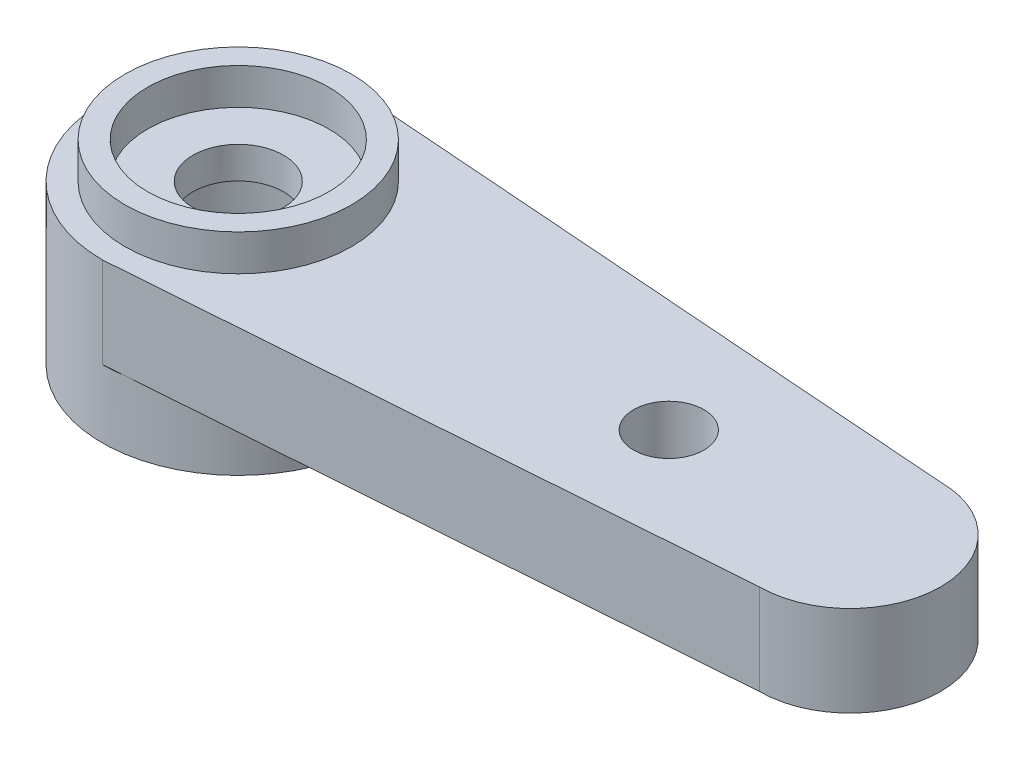
ISO-10303-21;
HEADER;
FILE_DESCRIPTION(('STEP AP214'),'2;1');
FILE_NAME('part.step','',(''),(''),'','','');
FILE_SCHEMA(('AUTOMOTIVE_DESIGN { 1 0 10303 214 1 1 1 1 }'));
ENDSEC;
DATA;
#1=APPLICATION_CONTEXT('core data for automotive mechanical design processes');
#2=APPLICATION_PROTOCOL_DEFINITION('international standard','automotive_design',2000,#1);
#3=PRODUCT_CONTEXT('',#1,'mechanical');
#4=PRODUCT('Part','Part','',(#3));
#5=PRODUCT_RELATED_PRODUCT_CATEGORY('part','',(#4));
#6=PRODUCT_DEFINITION_FORMATION('','',#4);
#7=PRODUCT_DEFINITION_CONTEXT('part definition',#1,'design');
#8=PRODUCT_DEFINITION('design','',#6,#7);
#9=PRODUCT_DEFINITION_SHAPE('','',#8);
#10=(LENGTH_UNIT() NAMED_UNIT(*) SI_UNIT(.MILLI.,.METRE.));
#11=(NAMED_UNIT(*) PLANE_ANGLE_UNIT() SI_UNIT($,.RADIAN.));
#12=(NAMED_UNIT(*) SI_UNIT($,.STERADIAN.) SOLID_ANGLE_UNIT());
#13=UNCERTAINTY_MEASURE_WITH_UNIT(LENGTH_MEASURE(1.E-05),#10,'distance_accuracy_value','');
#14=(GEOMETRIC_REPRESENTATION_CONTEXT(3) GLOBAL_UNCERTAINTY_ASSIGNED_CONTEXT((#13)) GLOBAL_UNIT_ASSIGNED_CONTEXT((#10,
#11,#12)) REPRESENTATION_CONTEXT('',''));
#15=CARTESIAN_POINT('',(0.,0.,0.));
#16=DIRECTION('',(0.,0.,1.));
#17=DIRECTION('',(1.,0.,0.));
#18=AXIS2_PLACEMENT_3D('',#15,#16,#17);
#19=CARTESIAN_POINT('',(0.,0.,0.));
#20=DIRECTION('',(0.,1.,0.));
#21=DIRECTION('',(0.,0.,1.));
#22=AXIS2_PLACEMENT_3D('',#19,#20,#21);
#23=PLANE('',#22);
#24=CARTESIAN_POINT('',(9.5,0.,0.));
#25=DIRECTION('',(0.,1.,0.));
#26=DIRECTION('',(0.,0.,1.));
#27=AXIS2_PLACEMENT_3D('',#24,#25,#26);
#28=CIRCLE('',#27,0.774999999999999);
#29=CARTESIAN_POINT('',(9.5,0.,0.774999999999999));
#30=VERTEX_POINT('',#29);
#31=EDGE_CURVE('E372',#30,#30,#28,.T.);
#32=ORIENTED_EDGE('',*,*,#31,.T.);
#33=EDGE_LOOP('',(#32));
#34=FACE_BOUND('',#33,.T.);
#35=CARTESIAN_POINT('',(0.,0.,0.));
#36=DIRECTION('',(0.,-1.,0.));
#37=DIRECTION('',(0.,0.,-1.));
#38=AXIS2_PLACEMENT_3D('',#35,#36,#37);
#39=CIRCLE('',#38,3.);
#40=CARTESIAN_POINT('',(0.442019099590729,0.,-2.96725784447476));
#41=VERTEX_POINT('',#40);
#42=CARTESIAN_POINT('',(0.442019099590729,0.,2.96725784447476));
#43=VERTEX_POINT('',#42);
#44=EDGE_CURVE('E11',#41,#43,#39,.T.);
#45=ORIENTED_EDGE('',*,*,#44,.F.);
#46=DIRECTION('',(0.997267754456709,0.,0.0738716855153118));
#47=VECTOR('',#46,1.);
#48=CARTESIAN_POINT('',(0.221009549795361,0.,-2.98362892223738));
#49=LINE('',#48,#47);
#50=CARTESIAN_POINT('',(13.5,0.,-2.));
#51=VERTEX_POINT('',#50);
#52=EDGE_CURVE('E72',#41,#51,#49,.T.);
#53=ORIENTED_EDGE('',*,*,#52,.T.);
#54=CARTESIAN_POINT('',(13.5,0.,0.));
#55=DIRECTION('',(0.,1.,0.));
#56=DIRECTION('',(0.,0.,1.));
#57=AXIS2_PLACEMENT_3D('',#54,#55,#56);
#58=CIRCLE('',#57,2.);
#59=CARTESIAN_POINT('',(13.5,0.,2.));
#60=VERTEX_POINT('',#59);
#61=EDGE_CURVE('E114',#60,#51,#58,.T.);
#62=ORIENTED_EDGE('',*,*,#61,.F.);
#63=DIRECTION('',(-0.997267754456709,0.,0.0738716855153118));
#64=VECTOR('',#63,1.);
#65=CARTESIAN_POINT('',(0.221009549795361,0.,2.98362892223738));
#66=LINE('',#65,#64);
#67=EDGE_CURVE('E116',#60,#43,#66,.T.);
#68=ORIENTED_EDGE('',*,*,#67,.T.);
#69=EDGE_LOOP('',(#45,#53,#62,#68));
#70=FACE_BOUND('',#69,.T.);
#71=ADVANCED_FACE('F36',(#34,#70),#23,.F.);
#72=CARTESIAN_POINT('',(0.,2.,0.));
#73=DIRECTION('',(0.,1.,0.));
#74=DIRECTION('',(0.,0.,1.));
#75=AXIS2_PLACEMENT_3D('',#72,#73,#74);
#76=PLANE('',#75);
#77=CARTESIAN_POINT('',(9.5,2.,0.));
#78=DIRECTION('',(0.,1.,0.));
#79=DIRECTION('',(0.,0.,1.));
#80=AXIS2_PLACEMENT_3D('',#77,#78,#79);
#81=CIRCLE('',#80,0.774999999999999);
#82=CARTESIAN_POINT('',(9.5,2.,0.774999999999999));
#83=VERTEX_POINT('',#82);
#84=EDGE_CURVE('E374',#83,#83,#81,.T.);
#85=ORIENTED_EDGE('',*,*,#84,.F.);
#86=EDGE_LOOP('',(#85));
#87=FACE_BOUND('',#86,.T.);
#88=DIRECTION('',(-0.997267754456709,0.,0.0738716855153118));
#89=VECTOR('',#88,1.);
#90=CARTESIAN_POINT('',(0.221009549795361,2.,2.98362892223738));
#91=LINE('',#90,#89);
#92=CARTESIAN_POINT('',(13.5,2.,2.));
#93=VERTEX_POINT('',#92);
#94=CARTESIAN_POINT('',(0.,2.,3.));
#95=VERTEX_POINT('',#94);
#96=EDGE_CURVE('E111',#93,#95,#91,.T.);
#97=ORIENTED_EDGE('',*,*,#96,.F.);
#98=CARTESIAN_POINT('',(13.5,2.,0.));
#99=DIRECTION('',(0.,1.,0.));
#100=DIRECTION('',(0.,0.,1.));
#101=AXIS2_PLACEMENT_3D('',#98,#99,#100);
#102=CIRCLE('',#101,2.);
#103=CARTESIAN_POINT('',(13.5,2.,-2.));
#104=VERTEX_POINT('',#103);
#105=EDGE_CURVE('E112',#93,#104,#102,.T.);
#106=ORIENTED_EDGE('',*,*,#105,.T.);
#107=DIRECTION('',(0.997267754456709,0.,0.0738716855153118));
#108=VECTOR('',#107,1.);
#109=CARTESIAN_POINT('',(0.221009549795361,2.,-2.98362892223738));
#110=LINE('',#109,#108);
#111=CARTESIAN_POINT('',(0.,2.,-3.));
#112=VERTEX_POINT('',#111);
#113=EDGE_CURVE('E138',#112,#104,#110,.T.);
#114=ORIENTED_EDGE('',*,*,#113,.F.);
#115=CARTESIAN_POINT('',(0.,2.,0.));
#116=DIRECTION('',(0.,1.,0.));
#117=DIRECTION('',(0.,0.,1.));
#118=AXIS2_PLACEMENT_3D('',#115,#116,#117);
#119=CIRCLE('',#118,3.);
#120=EDGE_CURVE('E56',#112,#95,#119,.T.);
#121=ORIENTED_EDGE('',*,*,#120,.T.);
#122=EDGE_LOOP('',(#97,#106,#114,#121));
#123=FACE_BOUND('',#122,.T.);
#124=CARTESIAN_POINT('',(0.,2.,0.));
#125=DIRECTION('',(0.,1.,0.));
#126=DIRECTION('',(0.,0.,1.));
#127=AXIS2_PLACEMENT_3D('',#124,#125,#126);
#128=CIRCLE('',#127,2.5);
#129=CARTESIAN_POINT('',(0.,2.,2.5));
#130=VERTEX_POINT('',#129);
#131=EDGE_CURVE('E134',#130,#130,#128,.T.);
#132=ORIENTED_EDGE('',*,*,#131,.F.);
#133=EDGE_LOOP('',(#132));
#134=FACE_BOUND('',#133,.T.);
#135=ADVANCED_FACE('F149',(#87,#123,#134),#76,.T.);
#136=CARTESIAN_POINT('',(0.221009549795361,2.,2.98362892223738));
#137=DIRECTION('',(0.0738716855153118,0.,0.997267754456709));
#138=DIRECTION('',(0.997267754456709,0.,-0.0738716855153118));
#139=AXIS2_PLACEMENT_3D('',#136,#137,#138);
#140=PLANE('',#139);
#141=ORIENTED_EDGE('',*,*,#67,.F.);
#142=DIRECTION('',(0.,-1.,0.));
#143=VECTOR('',#142,1.);
#144=CARTESIAN_POINT('',(13.5,2.,2.));
#145=LINE('',#144,#143);
#146=EDGE_CURVE('E47',#93,#60,#145,.T.);
#147=ORIENTED_EDGE('',*,*,#146,.F.);
#148=ORIENTED_EDGE('',*,*,#96,.T.);
#149=DIRECTION('',(0.,-1.,0.));
#150=VECTOR('',#149,1.);
#151=CARTESIAN_POINT('',(0.,2.,3.));
#152=LINE('',#151,#150);
#153=CARTESIAN_POINT('',(0.,0.,3.));
#154=VERTEX_POINT('',#153);
#155=EDGE_CURVE('E108',#95,#154,#152,.T.);
#156=ORIENTED_EDGE('',*,*,#155,.T.);
#157=EDGE_CURVE('E124',#43,#154,#66,.T.);
#158=ORIENTED_EDGE('',*,*,#157,.F.);
#159=EDGE_LOOP('',(#141,#147,#148,#156,#158));
#160=FACE_BOUND('',#159,.T.);
#161=ADVANCED_FACE('F38',(#160),#140,.T.);
#162=CARTESIAN_POINT('',(13.5,2.,0.));
#163=DIRECTION('',(0.,-1.,0.));
#164=DIRECTION('',(0.,0.,-1.));
#165=AXIS2_PLACEMENT_3D('',#162,#163,#164);
#166=CYLINDRICAL_SURFACE('',#165,2.);
#167=ORIENTED_EDGE('',*,*,#61,.T.);
#168=DIRECTION('',(0.,-1.,0.));
#169=VECTOR('',#168,1.);
#170=CARTESIAN_POINT('',(13.5,2.,-2.));
#171=LINE('',#170,#169);
#172=EDGE_CURVE('E107',#104,#51,#171,.T.);
#173=ORIENTED_EDGE('',*,*,#172,.F.);
#174=ORIENTED_EDGE('',*,*,#105,.F.);
#175=ORIENTED_EDGE('',*,*,#146,.T.);
#176=EDGE_LOOP('',(#167,#173,#174,#175));
#177=FACE_BOUND('',#176,.T.);
#178=ADVANCED_FACE('F153',(#177),#166,.T.);
#179=CARTESIAN_POINT('',(0.221009549795361,2.,-2.98362892223738));
#180=DIRECTION('',(0.0738716855153118,0.,-0.997267754456709));
#181=DIRECTION('',(-0.997267754456709,0.,-0.0738716855153118));
#182=AXIS2_PLACEMENT_3D('',#179,#180,#181);
#183=PLANE('',#182);
#184=CARTESIAN_POINT('',(0.,0.,-3.));
#185=VERTEX_POINT('',#184);
#186=EDGE_CURVE('E40',#185,#41,#49,.T.);
#187=ORIENTED_EDGE('',*,*,#186,.F.);
#188=DIRECTION('',(0.,-1.,0.));
#189=VECTOR('',#188,1.);
#190=CARTESIAN_POINT('',(0.,2.,-3.));
#191=LINE('',#190,#189);
#192=EDGE_CURVE('E102',#112,#185,#191,.T.);
#193=ORIENTED_EDGE('',*,*,#192,.F.);
#194=ORIENTED_EDGE('',*,*,#113,.T.);
#195=ORIENTED_EDGE('',*,*,#172,.T.);
#196=ORIENTED_EDGE('',*,*,#52,.F.);
#197=EDGE_LOOP('',(#187,#193,#194,#195,#196));
#198=FACE_BOUND('',#197,.T.);
#199=ADVANCED_FACE('F110',(#198),#183,.T.);
#200=CARTESIAN_POINT('',(0.,2.,0.));
#201=DIRECTION('',(0.,-1.,0.));
#202=DIRECTION('',(0.,0.,-1.));
#203=AXIS2_PLACEMENT_3D('',#200,#201,#202);
#204=CYLINDRICAL_SURFACE('',#203,3.);
#205=ORIENTED_EDGE('',*,*,#192,.T.);
#206=EDGE_CURVE('E96',#185,#41,#39,.T.);
#207=ORIENTED_EDGE('',*,*,#206,.T.);
#208=ORIENTED_EDGE('',*,*,#44,.T.);
#209=EDGE_CURVE('E78',#43,#154,#39,.T.);
#210=ORIENTED_EDGE('',*,*,#209,.T.);
#211=ORIENTED_EDGE('',*,*,#155,.F.);
#212=ORIENTED_EDGE('',*,*,#120,.F.);
#213=EDGE_LOOP('',(#205,#207,#208,#210,#211,#212));
#214=FACE_BOUND('',#213,.T.);
#215=CARTESIAN_POINT('',(0.,-1.5,0.));
#216=DIRECTION('',(0.,-1.,0.));
#217=DIRECTION('',(0.,0.,-1.));
#218=AXIS2_PLACEMENT_3D('',#215,#216,#217);
#219=CIRCLE('',#218,3.);
#220=CARTESIAN_POINT('',(0.,-1.5,-3.));
#221=VERTEX_POINT('',#220);
#222=EDGE_CURVE('E100',#221,#221,#219,.T.);
#223=ORIENTED_EDGE('',*,*,#222,.F.);
#224=EDGE_LOOP('',(#223));
#225=FACE_BOUND('',#224,.T.);
#226=ADVANCED_FACE('F103',(#214,#225),#204,.T.);
#227=CARTESIAN_POINT('',(0.,2.8,0.));
#228=DIRECTION('',(0.,-1.,0.));
#229=DIRECTION('',(0.,0.,-1.));
#230=AXIS2_PLACEMENT_3D('',#227,#228,#229);
#231=CYLINDRICAL_SURFACE('',#230,2.5);
#232=CARTESIAN_POINT('',(0.,2.8,0.));
#233=DIRECTION('',(0.,1.,0.));
#234=DIRECTION('',(0.,0.,1.));
#235=AXIS2_PLACEMENT_3D('',#232,#233,#234);
#236=CIRCLE('',#235,2.5);
#237=CARTESIAN_POINT('',(0.,2.8,2.5));
#238=VERTEX_POINT('',#237);
#239=EDGE_CURVE('E131',#238,#238,#236,.T.);
#240=ORIENTED_EDGE('',*,*,#239,.F.);
#241=EDGE_LOOP('',(#240));
#242=FACE_BOUND('',#241,.T.);
#243=ORIENTED_EDGE('',*,*,#131,.T.);
#244=EDGE_LOOP('',(#243));
#245=FACE_BOUND('',#244,.T.);
#246=ADVANCED_FACE('F167',(#242,#245),#231,.T.);
#247=CARTESIAN_POINT('',(0.,2.8,0.));
#248=DIRECTION('',(0.,1.,0.));
#249=DIRECTION('',(0.,0.,1.));
#250=AXIS2_PLACEMENT_3D('',#247,#248,#249);
#251=PLANE('',#250);
#252=CARTESIAN_POINT('',(0.,2.8,0.));
#253=DIRECTION('',(0.,1.,0.));
#254=DIRECTION('',(0.,0.,1.));
#255=AXIS2_PLACEMENT_3D('',#252,#253,#254);
#256=CIRCLE('',#255,2.);
#257=CARTESIAN_POINT('',(0.,2.8,2.));
#258=VERTEX_POINT('',#257);
#259=EDGE_CURVE('E347',#258,#258,#256,.T.);
#260=ORIENTED_EDGE('',*,*,#259,.F.);
#261=EDGE_LOOP('',(#260));
#262=FACE_BOUND('',#261,.T.);
#263=ORIENTED_EDGE('',*,*,#239,.T.);
#264=EDGE_LOOP('',(#263));
#265=FACE_BOUND('',#264,.T.);
#266=ADVANCED_FACE('F258',(#262,#265),#251,.T.);
#267=CARTESIAN_POINT('',(0.,0.,0.));
#268=DIRECTION('',(0.,-1.,0.));
#269=DIRECTION('',(0.,0.,-1.));
#270=AXIS2_PLACEMENT_3D('',#267,#268,#269);
#271=PLANE('',#270);
#272=ORIENTED_EDGE('',*,*,#209,.F.);
#273=ORIENTED_EDGE('',*,*,#157,.T.);
#274=EDGE_LOOP('',(#272,#273));
#275=FACE_BOUND('',#274,.T.);
#276=ADVANCED_FACE('F145',(#275),#271,.F.);
#277=ORIENTED_EDGE('',*,*,#206,.F.);
#278=ORIENTED_EDGE('',*,*,#186,.T.);
#279=EDGE_LOOP('',(#277,#278));
#280=FACE_BOUND('',#279,.T.);
#281=ADVANCED_FACE('F98',(#280),#271,.F.);
#282=CARTESIAN_POINT('',(0.,-1.5,0.));
#283=DIRECTION('',(0.,-1.,0.));
#284=DIRECTION('',(0.,0.,-1.));
#285=AXIS2_PLACEMENT_3D('',#282,#283,#284);
#286=PLANE('',#285);
#287=CARTESIAN_POINT('',(0.,-1.5,0.));
#288=DIRECTION('',(0.,-1.,0.));
#289=DIRECTION('',(0.,0.,-1.));
#290=AXIS2_PLACEMENT_3D('',#287,#288,#289);
#291=CIRCLE('',#290,2.);
#292=CARTESIAN_POINT('',(0.,-1.5,-2.));
#293=VERTEX_POINT('',#292);
#294=EDGE_CURVE('E353',#293,#293,#291,.T.);
#295=ORIENTED_EDGE('',*,*,#294,.F.);
#296=EDGE_LOOP('',(#295));
#297=FACE_BOUND('',#296,.T.);
#298=ORIENTED_EDGE('',*,*,#222,.T.);
#299=EDGE_LOOP('',(#298));
#300=FACE_BOUND('',#299,.T.);
#301=ADVANCED_FACE('F237',(#297,#300),#286,.T.);
#302=CARTESIAN_POINT('',(0.,1.3,0.));
#303=DIRECTION('',(0.,-1.,0.));
#304=DIRECTION('',(0.,0.,-1.));
#305=AXIS2_PLACEMENT_3D('',#302,#303,#304);
#306=CYLINDRICAL_SURFACE('',#305,2.);
#307=CARTESIAN_POINT('',(0.,1.3,0.));
#308=DIRECTION('',(0.,-1.,0.));
#309=DIRECTION('',(0.,0.,-1.));
#310=AXIS2_PLACEMENT_3D('',#307,#308,#309);
#311=CIRCLE('',#310,2.);
#312=CARTESIAN_POINT('',(0.,1.3,-2.));
#313=VERTEX_POINT('',#312);
#314=EDGE_CURVE('E130',#313,#313,#311,.T.);
#315=ORIENTED_EDGE('',*,*,#314,.F.);
#316=EDGE_LOOP('',(#315));
#317=FACE_BOUND('',#316,.T.);
#318=ORIENTED_EDGE('',*,*,#294,.T.);
#319=EDGE_LOOP('',(#318));
#320=FACE_BOUND('',#319,.T.);
#321=ADVANCED_FACE('F229',(#317,#320),#306,.F.);
#322=CARTESIAN_POINT('',(0.,1.3,0.));
#323=DIRECTION('',(0.,-1.,0.));
#324=DIRECTION('',(0.,0.,-1.));
#325=AXIS2_PLACEMENT_3D('',#322,#323,#324);
#326=PLANE('',#325);
#327=CARTESIAN_POINT('',(0.,1.3,0.));
#328=DIRECTION('',(0.,-1.,0.));
#329=DIRECTION('',(0.,0.,-1.));
#330=AXIS2_PLACEMENT_3D('',#327,#328,#329);
#331=CIRCLE('',#330,1.);
#332=CARTESIAN_POINT('',(0.,1.3,-1.));
#333=VERTEX_POINT('',#332);
#334=EDGE_CURVE('E350',#333,#333,#331,.T.);
#335=ORIENTED_EDGE('',*,*,#334,.F.);
#336=EDGE_LOOP('',(#335));
#337=FACE_BOUND('',#336,.T.);
#338=ORIENTED_EDGE('',*,*,#314,.T.);
#339=EDGE_LOOP('',(#338));
#340=FACE_BOUND('',#339,.T.);
#341=ADVANCED_FACE('F221',(#337,#340),#326,.T.);
#342=CARTESIAN_POINT('',(0.,2.,0.));
#343=DIRECTION('',(0.,1.,0.));
#344=DIRECTION('',(0.,0.,1.));
#345=AXIS2_PLACEMENT_3D('',#342,#343,#344);
#346=CYLINDRICAL_SURFACE('',#345,2.);
#347=CARTESIAN_POINT('',(0.,2.,0.));
#348=DIRECTION('',(0.,1.,0.));
#349=DIRECTION('',(0.,0.,1.));
#350=AXIS2_PLACEMENT_3D('',#347,#348,#349);
#351=CIRCLE('',#350,2.);
#352=CARTESIAN_POINT('',(0.,2.,2.));
#353=VERTEX_POINT('',#352);
#354=EDGE_CURVE('E349',#353,#353,#351,.T.);
#355=CARTESIAN_POINT('',(0.,2.,2.));
#356=CARTESIAN_POINT('',(0.,2.00833333333333,2.));
#357=CARTESIAN_POINT('',(0.,2.01666666666667,2.));
#358=CARTESIAN_POINT('',(0.,2.03333333333333,2.));
#359=CARTESIAN_POINT('',(0.,2.04166666666667,2.));
#360=CARTESIAN_POINT('',(0.,2.05833333333333,2.));
#361=CARTESIAN_POINT('',(0.,2.06666666666667,2.));
#362=CARTESIAN_POINT('',(0.,2.08333333333333,2.));
#363=CARTESIAN_POINT('',(0.,2.09166666666667,2.));
#364=CARTESIAN_POINT('',(0.,2.10833333333333,2.));
#365=CARTESIAN_POINT('',(0.,2.11666666666667,2.));
#366=CARTESIAN_POINT('',(0.,2.13333333333333,2.));
#367=CARTESIAN_POINT('',(0.,2.14166666666667,2.));
#368=CARTESIAN_POINT('',(0.,2.15833333333333,2.));
#369=CARTESIAN_POINT('',(0.,2.16666666666667,2.));
#370=CARTESIAN_POINT('',(0.,2.18333333333333,2.));
#371=CARTESIAN_POINT('',(0.,2.19166666666667,2.));
#372=CARTESIAN_POINT('',(0.,2.20833333333333,2.));
#373=CARTESIAN_POINT('',(0.,2.21666666666667,2.));
#374=CARTESIAN_POINT('',(0.,2.23333333333333,2.));
#375=CARTESIAN_POINT('',(0.,2.24166666666667,2.));
#376=CARTESIAN_POINT('',(0.,2.25833333333333,2.));
#377=CARTESIAN_POINT('',(0.,2.26666666666667,2.));
#378=CARTESIAN_POINT('',(0.,2.28333333333333,2.));
#379=CARTESIAN_POINT('',(0.,2.29166666666667,2.));
#380=CARTESIAN_POINT('',(0.,2.30833333333333,2.));
#381=CARTESIAN_POINT('',(0.,2.31666666666667,2.));
#382=CARTESIAN_POINT('',(0.,2.33333333333333,2.));
#383=CARTESIAN_POINT('',(0.,2.34166666666667,2.));
#384=CARTESIAN_POINT('',(0.,2.35833333333333,2.));
#385=CARTESIAN_POINT('',(0.,2.36666666666667,2.));
#386=CARTESIAN_POINT('',(0.,2.38333333333333,2.));
#387=CARTESIAN_POINT('',(0.,2.39166666666667,2.));
#388=CARTESIAN_POINT('',(0.,2.40833333333333,2.));
#389=CARTESIAN_POINT('',(0.,2.41666666666667,2.));
#390=CARTESIAN_POINT('',(0.,2.43333333333333,2.));
#391=CARTESIAN_POINT('',(0.,2.44166666666667,2.));
#392=CARTESIAN_POINT('',(0.,2.45833333333333,2.));
#393=CARTESIAN_POINT('',(0.,2.46666666666667,2.));
#394=CARTESIAN_POINT('',(0.,2.48333333333333,2.));
#395=CARTESIAN_POINT('',(0.,2.49166666666667,2.));
#396=CARTESIAN_POINT('',(0.,2.50833333333333,2.));
#397=CARTESIAN_POINT('',(0.,2.51666666666667,2.));
#398=CARTESIAN_POINT('',(0.,2.53333333333333,2.));
#399=CARTESIAN_POINT('',(0.,2.54166666666667,2.));
#400=CARTESIAN_POINT('',(0.,2.55833333333333,2.));
#401=CARTESIAN_POINT('',(0.,2.56666666666667,2.));
#402=CARTESIAN_POINT('',(0.,2.58333333333333,2.));
#403=CARTESIAN_POINT('',(0.,2.59166666666667,2.));
#404=CARTESIAN_POINT('',(0.,2.60833333333333,2.));
#405=CARTESIAN_POINT('',(0.,2.61666666666667,2.));
#406=CARTESIAN_POINT('',(0.,2.63333333333333,2.));
#407=CARTESIAN_POINT('',(0.,2.64166666666667,2.));
#408=CARTESIAN_POINT('',(0.,2.65833333333333,2.));
#409=CARTESIAN_POINT('',(0.,2.66666666666667,2.));
#410=CARTESIAN_POINT('',(0.,2.68333333333333,2.));
#411=CARTESIAN_POINT('',(0.,2.69166666666667,2.));
#412=CARTESIAN_POINT('',(0.,2.70833333333333,2.));
#413=CARTESIAN_POINT('',(0.,2.71666666666667,2.));
#414=CARTESIAN_POINT('',(0.,2.73333333333333,2.));
#415=CARTESIAN_POINT('',(0.,2.74166666666667,2.));
#416=CARTESIAN_POINT('',(0.,2.75833333333333,2.));
#417=CARTESIAN_POINT('',(0.,2.76666666666667,2.));
#418=CARTESIAN_POINT('',(0.,2.78333333333333,2.));
#419=CARTESIAN_POINT('',(0.,2.79166666666667,2.));
#420=CARTESIAN_POINT('',(0.,2.8,2.));
#421=B_SPLINE_CURVE_WITH_KNOTS('',3,(#355,#356,#357,#358,#359,#360,#361,#362,#363,#364,#365,
#366,#367,#368,#369,#370,#371,#372,#373,#374,#375,#376,#377,#378,#379,#380,#381,#382,#383,#384,
#385,#386,#387,#388,#389,#390,#391,#392,#393,#394,#395,#396,#397,#398,#399,#400,#401,#402,#403,
#404,#405,#406,#407,#408,#409,#410,#411,#412,#413,#414,#415,#416,#417,#418,#419,#420),
.UNSPECIFIED.,.F.,.F.,(4,2,2,2,2,2,2,2,2,2,2,2,2,2,2,2,2,2,2,2,2,2,2,2,2,2,2,2,2,2,2,2,4),(0.,
0.0249999999999998,0.0499999999999997,0.075,0.0999999999999998,0.125,0.15,0.175,0.2,0.225,0.25,
0.275,0.3,0.325,0.35,0.375,0.4,0.425,0.45,0.475,0.5,0.525,0.55,0.575,0.6,0.625,0.65,0.675,0.7,
0.725,0.75,0.775,0.8),.UNSPECIFIED.);
#422=EDGE_CURVE('BSEAM212',#353,#258,#421,.T.);
#423=ORIENTED_EDGE('',*,*,#354,.F.);
#424=ORIENTED_EDGE('',*,*,#259,.T.);
#425=ORIENTED_EDGE('',*,*,#422,.T.);
#426=ORIENTED_EDGE('',*,*,#422,.F.);
#427=EDGE_LOOP('',(#423,#425,#424,#426));
#428=FACE_BOUND('',#427,.T.);
#429=ADVANCED_FACE('F212',(#428),#346,.F.);
#430=CARTESIAN_POINT('',(0.,2.,0.));
#431=DIRECTION('',(0.,1.,0.));
#432=DIRECTION('',(0.,0.,1.));
#433=AXIS2_PLACEMENT_3D('',#430,#431,#432);
#434=PLANE('',#433);
#435=CARTESIAN_POINT('',(0.,2.,0.));
#436=DIRECTION('',(0.,1.,0.));
#437=DIRECTION('',(0.,0.,1.));
#438=AXIS2_PLACEMENT_3D('',#435,#436,#437);
#439=CIRCLE('',#438,1.);
#440=CARTESIAN_POINT('',(0.,2.,1.));
#441=VERTEX_POINT('',#440);
#442=EDGE_CURVE('E356',#441,#441,#439,.T.);
#443=ORIENTED_EDGE('',*,*,#442,.F.);
#444=EDGE_LOOP('',(#443));
#445=FACE_BOUND('',#444,.T.);
#446=ORIENTED_EDGE('',*,*,#354,.T.);
#447=EDGE_LOOP('',(#446));
#448=FACE_BOUND('',#447,.T.);
#449=ADVANCED_FACE('F205',(#445,#448),#434,.T.);
#450=CARTESIAN_POINT('',(0.,-1.5,0.));
#451=DIRECTION('',(0.,1.,0.));
#452=DIRECTION('',(0.,0.,1.));
#453=AXIS2_PLACEMENT_3D('',#450,#451,#452);
#454=CYLINDRICAL_SURFACE('',#453,1.);
#455=ORIENTED_EDGE('',*,*,#334,.T.);
#456=EDGE_LOOP('',(#455));
#457=FACE_BOUND('',#456,.T.);
#458=ORIENTED_EDGE('',*,*,#442,.T.);
#459=EDGE_LOOP('',(#458));
#460=FACE_BOUND('',#459,.T.);
#461=ADVANCED_FACE('F195',(#457,#460),#454,.F.);
#462=CARTESIAN_POINT('',(9.5,-1.5,0.));
#463=DIRECTION('',(0.,1.,0.));
#464=DIRECTION('',(0.,0.,1.));
#465=AXIS2_PLACEMENT_3D('',#462,#463,#464);
#466=CYLINDRICAL_SURFACE('',#465,0.774999999999999);
#467=ORIENTED_EDGE('',*,*,#84,.T.);
#468=EDGE_LOOP('',(#467));
#469=FACE_BOUND('',#468,.T.);
#470=ORIENTED_EDGE('',*,*,#31,.F.);
#471=EDGE_LOOP('',(#470));
#472=FACE_BOUND('',#471,.T.);
#473=ADVANCED_FACE('F191',(#469,#472),#466,.F.);
#474=CLOSED_SHELL('',(#71,#135,#161,#178,#199,#226,#246,#266,#276,#281,#301,#321,#341,#429,#449,
#461,#473));
#475=MANIFOLD_SOLID_BREP('B2',#474);
#476=ADVANCED_BREP_SHAPE_REPRESENTATION('',(#18,#475),#14);
#477=SHAPE_DEFINITION_REPRESENTATION(#9,#476);
ENDSEC;
END-ISO-10303-21;
